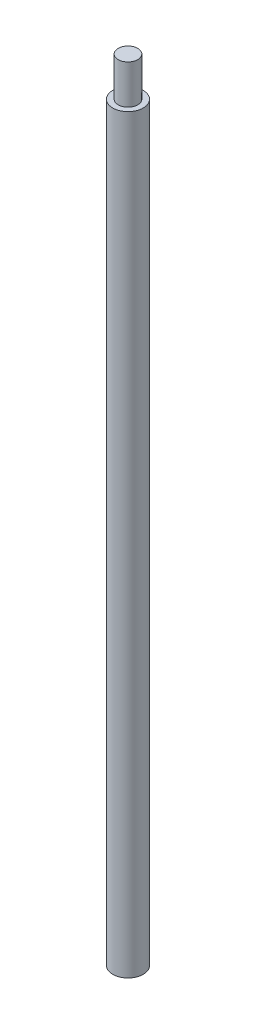
ISO-10303-21;
HEADER;
FILE_DESCRIPTION(('STEP AP214'),'2;1');
FILE_NAME('part.step','',(''),(''),'','','');
FILE_SCHEMA(('AUTOMOTIVE_DESIGN { 1 0 10303 214 1 1 1 1 }'));
ENDSEC;
DATA;
#1=APPLICATION_CONTEXT('core data for automotive mechanical design processes');
#2=APPLICATION_PROTOCOL_DEFINITION('international standard','automotive_design',2000,#1);
#3=PRODUCT_CONTEXT('',#1,'mechanical');
#4=PRODUCT('Part','Part','',(#3));
#5=PRODUCT_RELATED_PRODUCT_CATEGORY('part','',(#4));
#6=PRODUCT_DEFINITION_FORMATION('','',#4);
#7=PRODUCT_DEFINITION_CONTEXT('part definition',#1,'design');
#8=PRODUCT_DEFINITION('design','',#6,#7);
#9=PRODUCT_DEFINITION_SHAPE('','',#8);
#10=(LENGTH_UNIT() NAMED_UNIT(*) SI_UNIT(.MILLI.,.METRE.));
#11=(NAMED_UNIT(*) PLANE_ANGLE_UNIT() SI_UNIT($,.RADIAN.));
#12=(NAMED_UNIT(*) SI_UNIT($,.STERADIAN.) SOLID_ANGLE_UNIT());
#13=UNCERTAINTY_MEASURE_WITH_UNIT(LENGTH_MEASURE(1.E-05),#10,'distance_accuracy_value','');
#14=(GEOMETRIC_REPRESENTATION_CONTEXT(3) GLOBAL_UNCERTAINTY_ASSIGNED_CONTEXT((#13)) GLOBAL_UNIT_ASSIGNED_CONTEXT((#10,
#11,#12)) REPRESENTATION_CONTEXT('',''));
#15=CARTESIAN_POINT('',(0.,0.,0.));
#16=DIRECTION('',(0.,0.,1.));
#17=DIRECTION('',(1.,0.,0.));
#18=AXIS2_PLACEMENT_3D('',#15,#16,#17);
#19=CARTESIAN_POINT('',(0.,230.,0.));
#20=DIRECTION('',(0.,-1.,0.));
#21=DIRECTION('',(0.,0.,-1.));
#22=AXIS2_PLACEMENT_3D('',#19,#20,#21);
#23=CYLINDRICAL_SURFACE('',#22,4.675);
#24=CARTESIAN_POINT('',(0.,230.,0.));
#25=DIRECTION('',(0.,1.,0.));
#26=DIRECTION('',(0.,0.,1.));
#27=AXIS2_PLACEMENT_3D('',#24,#25,#26);
#28=CIRCLE('',#27,4.675);
#29=CARTESIAN_POINT('',(0.,230.,4.675));
#30=VERTEX_POINT('',#29);
#31=EDGE_CURVE('E38',#30,#30,#28,.T.);
#32=ORIENTED_EDGE('',*,*,#31,.F.);
#33=EDGE_LOOP('',(#32));
#34=FACE_BOUND('',#33,.T.);
#35=CARTESIAN_POINT('',(0.,0.,0.));
#36=DIRECTION('',(0.,1.,0.));
#37=DIRECTION('',(0.,0.,1.));
#38=AXIS2_PLACEMENT_3D('',#35,#36,#37);
#39=CIRCLE('',#38,4.675);
#40=CARTESIAN_POINT('',(0.,0.,4.675));
#41=VERTEX_POINT('',#40);
#42=EDGE_CURVE('E34',#41,#41,#39,.T.);
#43=ORIENTED_EDGE('',*,*,#42,.T.);
#44=EDGE_LOOP('',(#43));
#45=FACE_BOUND('',#44,.T.);
#46=ADVANCED_FACE('F31',(#34,#45),#23,.T.);
#47=CARTESIAN_POINT('',(0.,230.,0.));
#48=DIRECTION('',(0.,1.,0.));
#49=DIRECTION('',(0.,0.,1.));
#50=AXIS2_PLACEMENT_3D('',#47,#48,#49);
#51=PLANE('',#50);
#52=CARTESIAN_POINT('',(0.,230.,0.));
#53=DIRECTION('',(0.,1.,0.));
#54=DIRECTION('',(0.,0.,1.));
#55=AXIS2_PLACEMENT_3D('',#52,#53,#54);
#56=CIRCLE('',#55,3.);
#57=CARTESIAN_POINT('',(0.,230.,3.));
#58=VERTEX_POINT('',#57);
#59=EDGE_CURVE('E10',#58,#58,#56,.T.);
#60=ORIENTED_EDGE('',*,*,#59,.F.);
#61=EDGE_LOOP('',(#60));
#62=FACE_BOUND('',#61,.T.);
#63=ORIENTED_EDGE('',*,*,#31,.T.);
#64=EDGE_LOOP('',(#63));
#65=FACE_BOUND('',#64,.T.);
#66=ADVANCED_FACE('F55',(#62,#65),#51,.T.);
#67=CARTESIAN_POINT('',(0.,0.,0.));
#68=DIRECTION('',(0.,1.,0.));
#69=DIRECTION('',(0.,0.,1.));
#70=AXIS2_PLACEMENT_3D('',#67,#68,#69);
#71=PLANE('',#70);
#72=ORIENTED_EDGE('',*,*,#42,.F.);
#73=EDGE_LOOP('',(#72));
#74=FACE_BOUND('',#73,.T.);
#75=ADVANCED_FACE('F52',(#74),#71,.F.);
#76=CARTESIAN_POINT('',(0.,242.,0.));
#77=DIRECTION('',(0.,-1.,0.));
#78=DIRECTION('',(0.,0.,-1.));
#79=AXIS2_PLACEMENT_3D('',#76,#77,#78);
#80=CYLINDRICAL_SURFACE('',#79,3.);
#81=CARTESIAN_POINT('',(0.,242.,0.));
#82=DIRECTION('',(0.,1.,0.));
#83=DIRECTION('',(0.,0.,1.));
#84=AXIS2_PLACEMENT_3D('',#81,#82,#83);
#85=CIRCLE('',#84,3.);
#86=CARTESIAN_POINT('',(0.,242.,3.));
#87=VERTEX_POINT('',#86);
#88=EDGE_CURVE('E44',#87,#87,#85,.T.);
#89=ORIENTED_EDGE('',*,*,#88,.F.);
#90=EDGE_LOOP('',(#89));
#91=FACE_BOUND('',#90,.T.);
#92=ORIENTED_EDGE('',*,*,#59,.T.);
#93=EDGE_LOOP('',(#92));
#94=FACE_BOUND('',#93,.T.);
#95=ADVANCED_FACE('F54',(#91,#94),#80,.T.);
#96=CARTESIAN_POINT('',(0.,242.,0.));
#97=DIRECTION('',(0.,1.,0.));
#98=DIRECTION('',(0.,0.,1.));
#99=AXIS2_PLACEMENT_3D('',#96,#97,#98);
#100=PLANE('',#99);
#101=ORIENTED_EDGE('',*,*,#88,.T.);
#102=EDGE_LOOP('',(#101));
#103=FACE_BOUND('',#102,.T.);
#104=ADVANCED_FACE('F60',(#103),#100,.T.);
#105=CLOSED_SHELL('',(#46,#66,#75,#95,#104));
#106=MANIFOLD_SOLID_BREP('B2',#105);
#107=ADVANCED_BREP_SHAPE_REPRESENTATION('',(#18,#106),#14);
#108=SHAPE_DEFINITION_REPRESENTATION(#9,#107);
ENDSEC;
END-ISO-10303-21;
